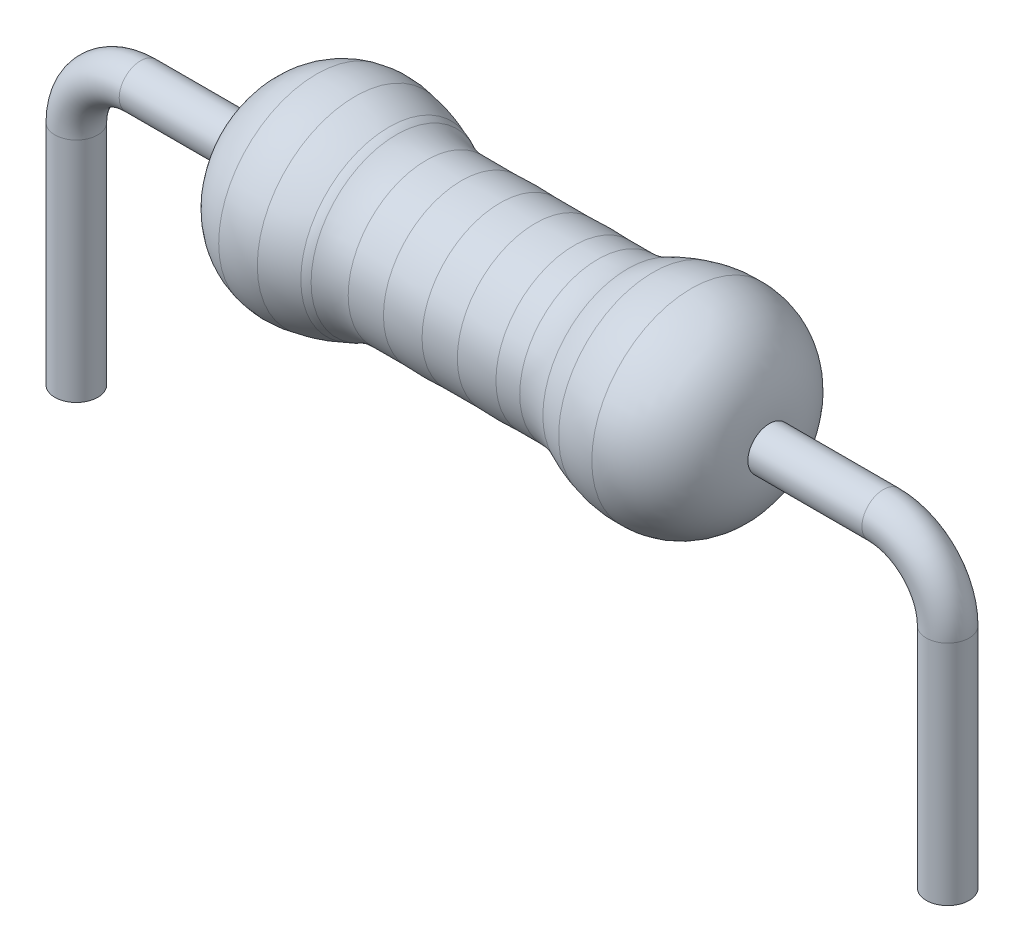
ISO-10303-21;
HEADER;
FILE_DESCRIPTION(('STEP AP214'),'2;1');
FILE_NAME('part.step','',(''),(''),'','','');
FILE_SCHEMA(('AUTOMOTIVE_DESIGN { 1 0 10303 214 1 1 1 1 }'));
ENDSEC;
DATA;
#1=APPLICATION_CONTEXT('core data for automotive mechanical design processes');
#2=APPLICATION_PROTOCOL_DEFINITION('international standard','automotive_design',2000,#1);
#3=PRODUCT_CONTEXT('',#1,'mechanical');
#4=PRODUCT('Part','Part','',(#3));
#5=PRODUCT_RELATED_PRODUCT_CATEGORY('part','',(#4));
#6=PRODUCT_DEFINITION_FORMATION('','',#4);
#7=PRODUCT_DEFINITION_CONTEXT('part definition',#1,'design');
#8=PRODUCT_DEFINITION('design','',#6,#7);
#9=PRODUCT_DEFINITION_SHAPE('','',#8);
#10=(LENGTH_UNIT() NAMED_UNIT(*) SI_UNIT(.MILLI.,.METRE.));
#11=(NAMED_UNIT(*) PLANE_ANGLE_UNIT() SI_UNIT($,.RADIAN.));
#12=(NAMED_UNIT(*) SI_UNIT($,.STERADIAN.) SOLID_ANGLE_UNIT());
#13=UNCERTAINTY_MEASURE_WITH_UNIT(LENGTH_MEASURE(1.E-05),#10,'distance_accuracy_value','');
#14=(GEOMETRIC_REPRESENTATION_CONTEXT(3) GLOBAL_UNCERTAINTY_ASSIGNED_CONTEXT((#13)) GLOBAL_UNIT_ASSIGNED_CONTEXT((#10,
#11,#12)) REPRESENTATION_CONTEXT('',''));
#15=CARTESIAN_POINT('',(0.,0.,0.));
#16=DIRECTION('',(0.,0.,1.));
#17=DIRECTION('',(1.,0.,0.));
#18=AXIS2_PLACEMENT_3D('',#15,#16,#17);
#19=CARTESIAN_POINT('',(-3.,0.,0.));
#20=DIRECTION('',(-1.,0.,0.));
#21=DIRECTION('',(0.,0.,1.));
#22=AXIS2_PLACEMENT_3D('',#19,#20,#21);
#23=CYLINDRICAL_SURFACE('',#22,0.91);
#24=CARTESIAN_POINT('',(0.272381778882498,0.,0.));
#25=DIRECTION('',(1.,0.,0.));
#26=DIRECTION('',(0.,0.,-1.));
#27=AXIS2_PLACEMENT_3D('',#24,#25,#26);
#28=CIRCLE('',#27,0.91);
#29=CARTESIAN_POINT('',(0.272381778882498,0.,-0.91));
#30=VERTEX_POINT('',#29);
#31=EDGE_CURVE('E58',#30,#30,#28,.T.);
#32=ORIENTED_EDGE('',*,*,#31,.F.);
#33=EDGE_LOOP('',(#32));
#34=FACE_BOUND('',#33,.T.);
#35=CARTESIAN_POINT('',(-0.138809110558752,0.,0.));
#36=DIRECTION('',(-1.,0.,0.));
#37=DIRECTION('',(0.,0.,1.));
#38=AXIS2_PLACEMENT_3D('',#35,#36,#37);
#39=CIRCLE('',#38,0.91);
#40=CARTESIAN_POINT('',(-0.138809110558752,0.,0.91));
#41=VERTEX_POINT('',#40);
#42=EDGE_CURVE('E67',#41,#41,#39,.T.);
#43=ORIENTED_EDGE('',*,*,#42,.F.);
#44=EDGE_LOOP('',(#43));
#45=FACE_BOUND('',#44,.T.);
#46=ADVANCED_FACE('F38',(#34,#45),#23,.T.);
#47=CARTESIAN_POINT('',(-0.588809110558741,0.,0.));
#48=DIRECTION('',(1.,0.,0.));
#49=DIRECTION('',(0.,0.,-1.));
#50=AXIS2_PLACEMENT_3D('',#47,#48,#49);
#51=CIRCLE('',#50,0.91);
#52=CARTESIAN_POINT('',(-0.588809110558741,0.,-0.91));
#53=VERTEX_POINT('',#52);
#54=EDGE_CURVE('E64',#53,#53,#51,.T.);
#55=ORIENTED_EDGE('',*,*,#54,.F.);
#56=EDGE_LOOP('',(#55));
#57=FACE_BOUND('',#56,.T.);
#58=CARTESIAN_POINT('',(-1.,0.,0.));
#59=DIRECTION('',(-1.,0.,0.));
#60=DIRECTION('',(0.,0.,1.));
#61=AXIS2_PLACEMENT_3D('',#58,#59,#60);
#62=CIRCLE('',#61,0.91);
#63=CARTESIAN_POINT('',(-1.,0.,0.91));
#64=VERTEX_POINT('',#63);
#65=EDGE_CURVE('E100',#64,#64,#62,.T.);
#66=ORIENTED_EDGE('',*,*,#65,.F.);
#67=EDGE_LOOP('',(#66));
#68=FACE_BOUND('',#67,.T.);
#69=ADVANCED_FACE('F127',(#57,#68),#23,.T.);
#70=CARTESIAN_POINT('',(-0.363809110558746,0.,0.));
#71=DIRECTION('',(-1.,0.,0.));
#72=DIRECTION('',(0.,0.,1.));
#73=AXIS2_PLACEMENT_3D('',#70,#71,#72);
#74=DEGENERATE_TOROIDAL_SURFACE('',#73,4.08493493451116,5.,.F.);
#75=ORIENTED_EDGE('',*,*,#42,.T.);
#76=EDGE_LOOP('',(#75));
#77=FACE_BOUND('',#76,.T.);
#78=ORIENTED_EDGE('',*,*,#54,.T.);
#79=EDGE_LOOP('',(#78));
#80=FACE_BOUND('',#79,.T.);
#81=ADVANCED_FACE('F134',(#77,#80),#74,.F.);
#82=CARTESIAN_POINT('',(0.497381778882508,0.,0.));
#83=DIRECTION('',(-1.,0.,0.));
#84=DIRECTION('',(0.,0.,1.));
#85=AXIS2_PLACEMENT_3D('',#82,#83,#84);
#86=DEGENERATE_TOROIDAL_SURFACE('',#85,4.08493493451116,5.,.F.);
#87=CARTESIAN_POINT('',(0.722381778882517,0.,0.));
#88=DIRECTION('',(-1.,0.,0.));
#89=DIRECTION('',(0.,0.,1.));
#90=AXIS2_PLACEMENT_3D('',#87,#88,#89);
#91=CIRCLE('',#90,0.91);
#92=CARTESIAN_POINT('',(0.722381778882517,0.,0.91));
#93=VERTEX_POINT('',#92);
#94=EDGE_CURVE('E61',#93,#93,#91,.T.);
#95=ORIENTED_EDGE('',*,*,#94,.T.);
#96=EDGE_LOOP('',(#95));
#97=FACE_BOUND('',#96,.T.);
#98=ORIENTED_EDGE('',*,*,#31,.T.);
#99=EDGE_LOOP('',(#98));
#100=FACE_BOUND('',#99,.T.);
#101=ADVANCED_FACE('F147',(#97,#100),#86,.F.);
#102=CARTESIAN_POINT('',(2.09,0.,0.));
#103=DIRECTION('',(-1.,0.,0.));
#104=DIRECTION('',(0.,0.,1.));
#105=AXIS2_PLACEMENT_3D('',#102,#103,#104);
#106=DEGENERATE_TOROIDAL_SURFACE('',#105,0.538062385321103,1.6980623853211,.F.);
#107=CARTESIAN_POINT('',(1.6439678861737,0.,0.));
#108=DIRECTION('',(1.,0.,0.));
#109=DIRECTION('',(0.,0.,-1.));
#110=AXIS2_PLACEMENT_3D('',#107,#108,#109);
#111=CIRCLE('',#110,1.10037321545118);
#112=CARTESIAN_POINT('',(1.6439678861737,0.,-1.10037321545118));
#113=VERTEX_POINT('',#112);
#114=EDGE_CURVE('E10',#113,#113,#111,.T.);
#115=ORIENTED_EDGE('',*,*,#114,.F.);
#116=EDGE_LOOP('',(#115));
#117=FACE_BOUND('',#116,.T.);
#118=CARTESIAN_POINT('',(1.35,0.,0.));
#119=DIRECTION('',(-1.,0.,0.));
#120=DIRECTION('',(0.,0.,1.));
#121=AXIS2_PLACEMENT_3D('',#118,#119,#120);
#122=CIRCLE('',#121,0.990275229357798);
#123=CARTESIAN_POINT('',(1.35,0.,0.990275229357798));
#124=VERTEX_POINT('',#123);
#125=EDGE_CURVE('E94',#124,#124,#122,.T.);
#126=ORIENTED_EDGE('',*,*,#125,.F.);
#127=EDGE_LOOP('',(#126));
#128=FACE_BOUND('',#127,.T.);
#129=ADVANCED_FACE('F143',(#117,#128),#106,.F.);
#130=CARTESIAN_POINT('',(1.,0.,0.));
#131=DIRECTION('',(-1.,0.,0.));
#132=DIRECTION('',(0.,0.,1.));
#133=AXIS2_PLACEMENT_3D('',#130,#131,#132);
#134=TOROIDAL_SURFACE('',#133,1.7131376146789,0.803137614678899);
#135=ORIENTED_EDGE('',*,*,#125,.T.);
#136=EDGE_LOOP('',(#135));
#137=FACE_BOUND('',#136,.T.);
#138=CARTESIAN_POINT('',(1.,0.,0.));
#139=DIRECTION('',(-1.,0.,0.));
#140=DIRECTION('',(0.,0.,1.));
#141=AXIS2_PLACEMENT_3D('',#138,#139,#140);
#142=CIRCLE('',#141,0.91);
#143=CARTESIAN_POINT('',(1.,0.,0.91));
#144=VERTEX_POINT('',#143);
#145=EDGE_CURVE('E97',#144,#144,#142,.T.);
#146=ORIENTED_EDGE('',*,*,#145,.F.);
#147=EDGE_LOOP('',(#146));
#148=FACE_BOUND('',#147,.T.);
#149=ADVANCED_FACE('F124',(#137,#148),#134,.F.);
#150=ORIENTED_EDGE('',*,*,#94,.F.);
#151=EDGE_LOOP('',(#150));
#152=FACE_BOUND('',#151,.T.);
#153=ORIENTED_EDGE('',*,*,#145,.T.);
#154=EDGE_LOOP('',(#153));
#155=FACE_BOUND('',#154,.T.);
#156=ADVANCED_FACE('F115',(#152,#155),#23,.T.);
#157=CARTESIAN_POINT('',(-1.,0.,0.));
#158=DIRECTION('',(-1.,0.,0.));
#159=DIRECTION('',(0.,0.,1.));
#160=AXIS2_PLACEMENT_3D('',#157,#158,#159);
#161=TOROIDAL_SURFACE('',#160,1.66742959397039,0.75742959397039);
#162=ORIENTED_EDGE('',*,*,#65,.T.);
#163=EDGE_LOOP('',(#162));
#164=FACE_BOUND('',#163,.T.);
#165=CARTESIAN_POINT('',(-1.34789487998604,0.,0.));
#166=DIRECTION('',(-1.,0.,0.));
#167=DIRECTION('',(0.,0.,1.));
#168=AXIS2_PLACEMENT_3D('',#165,#166,#167);
#169=CIRCLE('',#168,0.994622978142596);
#170=CARTESIAN_POINT('',(-1.34789487998604,0.,0.994622978142596));
#171=VERTEX_POINT('',#170);
#172=EDGE_CURVE('E106',#171,#171,#169,.T.);
#173=ORIENTED_EDGE('',*,*,#172,.F.);
#174=EDGE_LOOP('',(#173));
#175=FACE_BOUND('',#174,.T.);
#176=ADVANCED_FACE('F113',(#164,#175),#161,.F.);
#177=CARTESIAN_POINT('',(-1.5495566835561,0.,0.));
#178=DIRECTION('',(-1.,0.,0.));
#179=DIRECTION('',(0.,0.,1.));
#180=AXIS2_PLACEMENT_3D('',#177,#178,#179);
#181=TOROIDAL_SURFACE('',#180,0.604621850195135,0.439053940671782);
#182=ORIENTED_EDGE('',*,*,#172,.T.);
#183=EDGE_LOOP('',(#182));
#184=FACE_BOUND('',#183,.T.);
#185=CARTESIAN_POINT('',(-1.43418626582218,0.,0.));
#186=DIRECTION('',(1.,0.,0.));
#187=DIRECTION('',(0.,0.,-1.));
#188=AXIS2_PLACEMENT_3D('',#185,#186,#187);
#189=CIRCLE('',#188,1.02824671907245);
#190=CARTESIAN_POINT('',(-1.43418626582218,0.,-1.02824671907245));
#191=VERTEX_POINT('',#190);
#192=EDGE_CURVE('E53',#191,#191,#189,.T.);
#193=ORIENTED_EDGE('',*,*,#192,.T.);
#194=EDGE_LOOP('',(#193));
#195=FACE_BOUND('',#194,.T.);
#196=ADVANCED_FACE('F110',(#184,#195),#181,.T.);
#197=CARTESIAN_POINT('',(-2.09,0.,0.));
#198=DIRECTION('',(-1.,0.,0.));
#199=DIRECTION('',(0.,0.,1.));
#200=AXIS2_PLACEMENT_3D('',#197,#198,#199);
#201=DEGENERATE_TOROIDAL_SURFACE('',#200,0.538062385321103,1.6980623853211,.F.);
#202=CARTESIAN_POINT('',(-1.82991018823101,0.,0.));
#203=DIRECTION('',(-1.,0.,0.));
#204=DIRECTION('',(0.,0.,1.));
#205=AXIS2_PLACEMENT_3D('',#202,#203,#204);
#206=CIRCLE('',#205,1.13996298822257);
#207=CARTESIAN_POINT('',(-1.82991018823101,0.,1.13996298822257));
#208=VERTEX_POINT('',#207);
#209=EDGE_CURVE('E49',#208,#208,#206,.T.);
#210=ORIENTED_EDGE('',*,*,#209,.F.);
#211=EDGE_LOOP('',(#210));
#212=FACE_BOUND('',#211,.T.);
#213=ORIENTED_EDGE('',*,*,#192,.F.);
#214=EDGE_LOOP('',(#213));
#215=FACE_BOUND('',#214,.T.);
#216=ADVANCED_FACE('F122',(#212,#215),#201,.F.);
#217=CARTESIAN_POINT('',(-2.05491018823105,0.,0.));
#218=DIRECTION('',(-1.,0.,0.));
#219=DIRECTION('',(0.,0.,1.));
#220=AXIS2_PLACEMENT_3D('',#217,#218,#219);
#221=DEGENERATE_TOROIDAL_SURFACE('',#220,0.165604224727317,1.,.T.);
#222=ORIENTED_EDGE('',*,*,#209,.T.);
#223=EDGE_LOOP('',(#222));
#224=FACE_BOUND('',#223,.T.);
#225=CARTESIAN_POINT('',(-2.27991018823105,0.,0.));
#226=DIRECTION('',(1.,0.,0.));
#227=DIRECTION('',(0.,0.,-1.));
#228=AXIS2_PLACEMENT_3D('',#225,#226,#227);
#229=CIRCLE('',#228,1.13996298822257);
#230=CARTESIAN_POINT('',(-2.27991018823105,0.,-1.13996298822257));
#231=VERTEX_POINT('',#230);
#232=EDGE_CURVE('E45',#231,#231,#229,.T.);
#233=ORIENTED_EDGE('',*,*,#232,.T.);
#234=EDGE_LOOP('',(#233));
#235=FACE_BOUND('',#234,.T.);
#236=ADVANCED_FACE('F176',(#224,#235),#221,.T.);
#237=CARTESIAN_POINT('',(-5.08,-3.4,0.));
#238=DIRECTION('',(0.,-1.,0.));
#239=DIRECTION('',(1.,0.,0.));
#240=AXIS2_PLACEMENT_3D('',#237,#238,#239);
#241=PLANE('',#240);
#242=CARTESIAN_POINT('',(-5.08,-3.4,0.));
#243=DIRECTION('',(0.,-1.,0.));
#244=DIRECTION('',(1.,0.,0.));
#245=AXIS2_PLACEMENT_3D('',#242,#243,#244);
#246=CIRCLE('',#245,0.25);
#247=CARTESIAN_POINT('',(-4.83,-3.4,0.));
#248=VERTEX_POINT('',#247);
#249=EDGE_CURVE('E73',#248,#248,#246,.T.);
#250=ORIENTED_EDGE('',*,*,#249,.T.);
#251=EDGE_LOOP('',(#250));
#252=FACE_BOUND('',#251,.T.);
#253=ADVANCED_FACE('F173',(#252),#241,.T.);
#254=CARTESIAN_POINT('',(-5.08,-0.75,0.));
#255=DIRECTION('',(0.,-1.,0.));
#256=DIRECTION('',(0.,0.,-1.));
#257=AXIS2_PLACEMENT_3D('',#254,#255,#256);
#258=CYLINDRICAL_SURFACE('',#257,0.25);
#259=ORIENTED_EDGE('',*,*,#249,.F.);
#260=EDGE_LOOP('',(#259));
#261=FACE_BOUND('',#260,.T.);
#262=CARTESIAN_POINT('',(-5.08,-0.750000000000001,0.));
#263=DIRECTION('',(0.,-1.,0.));
#264=DIRECTION('',(1.,0.,0.));
#265=AXIS2_PLACEMENT_3D('',#262,#263,#264);
#266=CIRCLE('',#265,0.25);
#267=CARTESIAN_POINT('',(-5.33,-0.750000000000001,0.));
#268=VERTEX_POINT('',#267);
#269=EDGE_CURVE('E76',#268,#268,#266,.T.);
#270=ORIENTED_EDGE('',*,*,#269,.T.);
#271=EDGE_LOOP('',(#270));
#272=FACE_BOUND('',#271,.T.);
#273=ADVANCED_FACE('F170',(#261,#272),#258,.T.);
#274=CARTESIAN_POINT('',(-4.33,-0.75,0.));
#275=DIRECTION('',(0.,0.,1.));
#276=DIRECTION('',(1.,0.,0.));
#277=AXIS2_PLACEMENT_3D('',#274,#275,#276);
#278=TOROIDAL_SURFACE('',#277,0.75,0.25);
#279=CARTESIAN_POINT('',(-4.33,0.,0.));
#280=DIRECTION('',(-1.,0.,0.));
#281=DIRECTION('',(0.,-1.,0.));
#282=AXIS2_PLACEMENT_3D('',#279,#280,#281);
#283=CIRCLE('',#282,0.25);
#284=CARTESIAN_POINT('',(-4.33,0.25,0.));
#285=VERTEX_POINT('',#284);
#286=EDGE_CURVE('E79',#285,#285,#283,.T.);
#287=CARTESIAN_POINT('',(-4.33,-0.75,0.));
#288=DIRECTION('',(0.,0.,1.));
#289=DIRECTION('',(1.,0.,0.));
#290=AXIS2_PLACEMENT_3D('',#287,#288,#289);
#291=CIRCLE('',#290,1.);
#292=EDGE_CURVE('',#285,#268,#291,.T.);
#293=ORIENTED_EDGE('',*,*,#286,.T.);
#294=ORIENTED_EDGE('',*,*,#269,.F.);
#295=ORIENTED_EDGE('',*,*,#292,.T.);
#296=ORIENTED_EDGE('',*,*,#292,.F.);
#297=EDGE_LOOP('',(#293,#295,#294,#296));
#298=FACE_BOUND('',#297,.T.);
#299=ADVANCED_FACE('F166',(#298),#278,.T.);
#300=CARTESIAN_POINT('',(4.33,0.,0.));
#301=DIRECTION('',(-1.,0.,0.));
#302=DIRECTION('',(0.,0.,1.));
#303=AXIS2_PLACEMENT_3D('',#300,#301,#302);
#304=CYLINDRICAL_SURFACE('',#303,0.25);
#305=CARTESIAN_POINT('',(-3.,0.,0.));
#306=DIRECTION('',(-1.,0.,0.));
#307=DIRECTION('',(0.,0.,1.));
#308=AXIS2_PLACEMENT_3D('',#305,#306,#307);
#309=CIRCLE('',#308,0.25);
#310=CARTESIAN_POINT('',(-3.,0.,0.25));
#311=VERTEX_POINT('',#310);
#312=EDGE_CURVE('E70',#311,#311,#309,.F.);
#313=ORIENTED_EDGE('',*,*,#312,.F.);
#314=EDGE_LOOP('',(#313));
#315=FACE_BOUND('',#314,.T.);
#316=ORIENTED_EDGE('',*,*,#286,.F.);
#317=EDGE_LOOP('',(#316));
#318=FACE_BOUND('',#317,.T.);
#319=ADVANCED_FACE('F162',(#315,#318),#304,.T.);
#320=CARTESIAN_POINT('',(-2.09,0.,0.));
#321=DIRECTION('',(-1.,0.,0.));
#322=DIRECTION('',(0.,0.,1.));
#323=AXIS2_PLACEMENT_3D('',#320,#321,#322);
#324=DEGENERATE_TOROIDAL_SURFACE('',#323,0.25,0.909999999999999,.T.);
#325=ORIENTED_EDGE('',*,*,#232,.F.);
#326=EDGE_LOOP('',(#325));
#327=FACE_BOUND('',#326,.T.);
#328=ORIENTED_EDGE('',*,*,#312,.T.);
#329=EDGE_LOOP('',(#328));
#330=FACE_BOUND('',#329,.T.);
#331=ADVANCED_FACE('F165',(#327,#330),#324,.T.);
#332=CARTESIAN_POINT('',(2.05007810311884,0.,0.));
#333=DIRECTION('',(-1.,0.,0.));
#334=DIRECTION('',(0.,0.,1.));
#335=AXIS2_PLACEMENT_3D('',#332,#333,#334);
#336=DEGENERATE_TOROIDAL_SURFACE('',#335,0.239430685010662,1.4,.F.);
#337=CARTESIAN_POINT('',(2.09,0.,0.));
#338=DIRECTION('',(-1.,0.,0.));
#339=DIRECTION('',(0.,0.,1.));
#340=AXIS2_PLACEMENT_3D('',#337,#338,#339);
#341=CIRCLE('',#340,1.16);
#342=CARTESIAN_POINT('',(2.09,0.,1.16));
#343=VERTEX_POINT('',#342);
#344=EDGE_CURVE('E91',#343,#343,#341,.T.);
#345=ORIENTED_EDGE('',*,*,#344,.T.);
#346=EDGE_LOOP('',(#345));
#347=FACE_BOUND('',#346,.T.);
#348=ORIENTED_EDGE('',*,*,#114,.T.);
#349=EDGE_LOOP('',(#348));
#350=FACE_BOUND('',#349,.T.);
#351=ADVANCED_FACE('F194',(#347,#350),#336,.F.);
#352=CARTESIAN_POINT('',(5.08,-3.4,0.));
#353=DIRECTION('',(0.,1.,0.));
#354=DIRECTION('',(-1.,0.,0.));
#355=AXIS2_PLACEMENT_3D('',#352,#353,#354);
#356=PLANE('',#355);
#357=CARTESIAN_POINT('',(5.08,-3.4,0.));
#358=DIRECTION('',(0.,1.,0.));
#359=DIRECTION('',(-1.,0.,0.));
#360=AXIS2_PLACEMENT_3D('',#357,#358,#359);
#361=CIRCLE('',#360,0.25);
#362=CARTESIAN_POINT('',(4.83,-3.4,0.));
#363=VERTEX_POINT('',#362);
#364=EDGE_CURVE('E88',#363,#363,#361,.T.);
#365=ORIENTED_EDGE('',*,*,#364,.F.);
#366=EDGE_LOOP('',(#365));
#367=FACE_BOUND('',#366,.T.);
#368=ADVANCED_FACE('F40',(#367),#356,.F.);
#369=CARTESIAN_POINT('',(5.08,-3.4,0.));
#370=DIRECTION('',(0.,1.,0.));
#371=DIRECTION('',(0.,0.,1.));
#372=AXIS2_PLACEMENT_3D('',#369,#370,#371);
#373=CYLINDRICAL_SURFACE('',#372,0.25);
#374=CARTESIAN_POINT('',(5.08,-0.75,0.));
#375=DIRECTION('',(0.,1.,0.));
#376=DIRECTION('',(-1.,0.,0.));
#377=AXIS2_PLACEMENT_3D('',#374,#375,#376);
#378=CIRCLE('',#377,0.25);
#379=CARTESIAN_POINT('',(5.33,-0.75,0.));
#380=VERTEX_POINT('',#379);
#381=EDGE_CURVE('E85',#380,#380,#378,.T.);
#382=ORIENTED_EDGE('',*,*,#381,.F.);
#383=EDGE_LOOP('',(#382));
#384=FACE_BOUND('',#383,.T.);
#385=ORIENTED_EDGE('',*,*,#364,.T.);
#386=EDGE_LOOP('',(#385));
#387=FACE_BOUND('',#386,.T.);
#388=ADVANCED_FACE('F154',(#384,#387),#373,.T.);
#389=CARTESIAN_POINT('',(4.33,-0.75,0.));
#390=DIRECTION('',(0.,0.,1.));
#391=DIRECTION('',(1.,0.,0.));
#392=AXIS2_PLACEMENT_3D('',#389,#390,#391);
#393=TOROIDAL_SURFACE('',#392,0.75,0.25);
#394=CARTESIAN_POINT('',(4.33,0.,0.));
#395=DIRECTION('',(-1.,0.,0.));
#396=DIRECTION('',(0.,-1.,0.));
#397=AXIS2_PLACEMENT_3D('',#394,#395,#396);
#398=CIRCLE('',#397,0.25);
#399=CARTESIAN_POINT('',(4.33,0.25,0.));
#400=VERTEX_POINT('',#399);
#401=EDGE_CURVE('E82',#400,#400,#398,.T.);
#402=CARTESIAN_POINT('',(4.33,-0.75,0.));
#403=DIRECTION('',(0.,0.,1.));
#404=DIRECTION('',(1.,0.,0.));
#405=AXIS2_PLACEMENT_3D('',#402,#403,#404);
#406=CIRCLE('',#405,1.);
#407=EDGE_CURVE('',#380,#400,#406,.T.);
#408=ORIENTED_EDGE('',*,*,#381,.T.);
#409=ORIENTED_EDGE('',*,*,#401,.F.);
#410=ORIENTED_EDGE('',*,*,#407,.T.);
#411=ORIENTED_EDGE('',*,*,#407,.F.);
#412=EDGE_LOOP('',(#408,#410,#409,#411));
#413=FACE_BOUND('',#412,.T.);
#414=ADVANCED_FACE('F157',(#413),#393,.T.);
#415=ORIENTED_EDGE('',*,*,#401,.T.);
#416=EDGE_LOOP('',(#415));
#417=FACE_BOUND('',#416,.T.);
#418=CARTESIAN_POINT('',(3.,0.,0.));
#419=DIRECTION('',(-1.,0.,0.));
#420=DIRECTION('',(0.,0.,1.));
#421=AXIS2_PLACEMENT_3D('',#418,#419,#420);
#422=CIRCLE('',#421,0.25);
#423=CARTESIAN_POINT('',(3.,0.,0.25));
#424=VERTEX_POINT('',#423);
#425=EDGE_CURVE('E103',#424,#424,#422,.T.);
#426=ORIENTED_EDGE('',*,*,#425,.F.);
#427=EDGE_LOOP('',(#426));
#428=FACE_BOUND('',#427,.T.);
#429=ADVANCED_FACE('F152',(#417,#428),#304,.T.);
#430=CARTESIAN_POINT('',(2.09,0.,0.));
#431=DIRECTION('',(-1.,0.,0.));
#432=DIRECTION('',(0.,0.,1.));
#433=AXIS2_PLACEMENT_3D('',#430,#431,#432);
#434=DEGENERATE_TOROIDAL_SURFACE('',#433,0.25,0.909999999999999,.T.);
#435=ORIENTED_EDGE('',*,*,#425,.T.);
#436=EDGE_LOOP('',(#435));
#437=FACE_BOUND('',#436,.T.);
#438=ORIENTED_EDGE('',*,*,#344,.F.);
#439=EDGE_LOOP('',(#438));
#440=FACE_BOUND('',#439,.T.);
#441=ADVANCED_FACE('F149',(#437,#440),#434,.T.);
#442=CLOSED_SHELL('',(#46,#69,#81,#101,#129,#149,#156,#176,#196,#216,#236,#253,#273,#299,#319,
#331,#351,#368,#388,#414,#429,#441));
#443=MANIFOLD_SOLID_BREP('B2',#442);
#444=ADVANCED_BREP_SHAPE_REPRESENTATION('',(#18,#443),#14);
#445=SHAPE_DEFINITION_REPRESENTATION(#9,#444);
ENDSEC;
END-ISO-10303-21;
